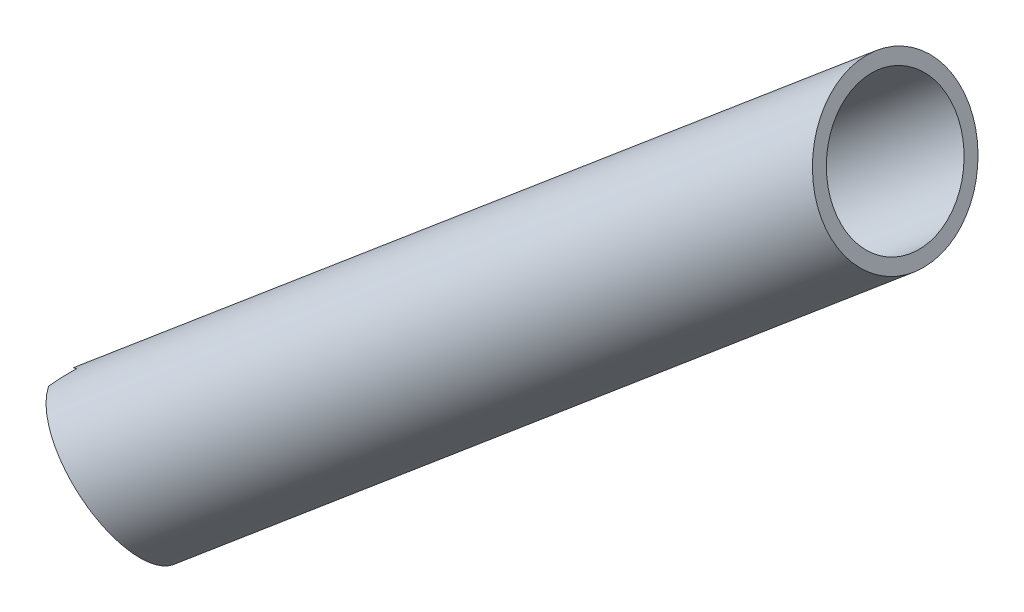
ISO-10303-21;
HEADER;
FILE_DESCRIPTION(('STEP AP214'),'2;1');
FILE_NAME('part.step','',(''),(''),'','','');
FILE_SCHEMA(('AUTOMOTIVE_DESIGN { 1 0 10303 214 1 1 1 1 }'));
ENDSEC;
DATA;
#1=APPLICATION_CONTEXT('core data for automotive mechanical design processes');
#2=APPLICATION_PROTOCOL_DEFINITION('international standard','automotive_design',2000,#1);
#3=PRODUCT_CONTEXT('',#1,'mechanical');
#4=PRODUCT('Part','Part','',(#3));
#5=PRODUCT_RELATED_PRODUCT_CATEGORY('part','',(#4));
#6=PRODUCT_DEFINITION_FORMATION('','',#4);
#7=PRODUCT_DEFINITION_CONTEXT('part definition',#1,'design');
#8=PRODUCT_DEFINITION('design','',#6,#7);
#9=PRODUCT_DEFINITION_SHAPE('','',#8);
#10=(LENGTH_UNIT() NAMED_UNIT(*) SI_UNIT(.MILLI.,.METRE.));
#11=(NAMED_UNIT(*) PLANE_ANGLE_UNIT() SI_UNIT($,.RADIAN.));
#12=(NAMED_UNIT(*) SI_UNIT($,.STERADIAN.) SOLID_ANGLE_UNIT());
#13=UNCERTAINTY_MEASURE_WITH_UNIT(LENGTH_MEASURE(1.E-05),#10,'distance_accuracy_value','');
#14=(GEOMETRIC_REPRESENTATION_CONTEXT(3) GLOBAL_UNCERTAINTY_ASSIGNED_CONTEXT((#13)) GLOBAL_UNIT_ASSIGNED_CONTEXT((#10,
#11,#12)) REPRESENTATION_CONTEXT('',''));
#15=CARTESIAN_POINT('',(0.,0.,0.));
#16=DIRECTION('',(0.,0.,1.));
#17=DIRECTION('',(1.,0.,0.));
#18=AXIS2_PLACEMENT_3D('',#15,#16,#17);
#19=CARTESIAN_POINT('',(-160.,500.,-1140.));
#20=DIRECTION('',(0.764911198117051,0.64413574578278,0.));
#21=DIRECTION('',(-0.64413574578278,0.764911198117051,0.));
#22=AXIS2_PLACEMENT_3D('',#19,#20,#21);
#23=CYLINDRICAL_SURFACE('',#22,7.90000000000002);
#24=CARTESIAN_POINT('',(-64.9999999999999,580.,-1140.));
#25=DIRECTION('',(0.939391078868926,0.342847489332319,0.));
#26=DIRECTION('',(-0.342847489332319,0.939391078868926,0.));
#27=AXIS2_PLACEMENT_3D('',#24,#25,#26);
#28=ELLIPSE('',#27,8.40970302753142,7.90000000000002);
#29=CARTESIAN_POINT('',(-67.8832455690195,587.9,-1140.));
#30=VERTEX_POINT('',#29);
#31=EDGE_CURVE('E91',#30,#30,#28,.T.);
#32=ORIENTED_EDGE('',*,*,#31,.T.);
#33=EDGE_LOOP('',(#32));
#34=FACE_BOUND('',#33,.T.);
#35=CARTESIAN_POINT('',(-149.806560441629,504.219410276848,-1147.15992461063));
#36=CARTESIAN_POINT('',(-149.803412714936,504.062578865998,-1147.10303301487));
#37=CARTESIAN_POINT('',(-149.803002824694,503.90666757739,-1147.04351815598));
#38=CARTESIAN_POINT('',(-149.807174148805,503.596954687256,-1146.91949265139));
#39=CARTESIAN_POINT('',(-149.811754107092,503.443152564667,-1146.85498326673));
#40=CARTESIAN_POINT('',(-149.825416717647,503.137909616455,-1146.72121745741));
#41=CARTESIAN_POINT('',(-149.834497559939,502.986467866867,-1146.65196295059));
#42=CARTESIAN_POINT('',(-149.856708176099,502.686082127626,-1146.50883251815));
#43=CARTESIAN_POINT('',(-149.869838294467,502.537138351631,-1146.43495619976));
#44=CARTESIAN_POINT('',(-149.914918191717,502.091648632249,-1146.20515941715));
#45=CARTESIAN_POINT('',(-149.952418847364,501.799207149699,-1146.04228196853));
#46=CARTESIAN_POINT('',(-150.038602793966,501.227098720645,-1145.69816413877));
#47=CARTESIAN_POINT('',(-150.08728545058,500.947431050579,-1145.51692479959));
#48=CARTESIAN_POINT('',(-150.176166467694,500.485993797294,-1145.19295142569));
#49=CARTESIAN_POINT('',(-150.21444651852,500.30030376809,-1145.05525603021));
#50=CARTESIAN_POINT('',(-150.293177031898,499.93748765105,-1144.76960566888));
#51=CARTESIAN_POINT('',(-150.333627037572,499.76035977529,-1144.62165286079));
#52=CARTESIAN_POINT('',(-150.41493741318,499.416706923316,-1144.31472636185));
#53=CARTESIAN_POINT('',(-150.455796668533,499.250159211458,-1144.15577795003));
#54=CARTESIAN_POINT('',(-150.535984940902,498.929712093816,-1143.82523144126));
#55=CARTESIAN_POINT('',(-150.575314676885,498.77580670659,-1143.65363940014));
#56=CARTESIAN_POINT('',(-150.636413726883,498.537191613577,-1143.36134630922));
#57=CARTESIAN_POINT('',(-150.659369208026,498.447666380083,-1143.24482136708));
#58=CARTESIAN_POINT('',(-150.702959480765,498.276328771042,-1143.00574885048));
#59=CARTESIAN_POINT('',(-150.723593932405,498.194517525633,-1142.88320039753));
#60=CARTESIAN_POINT('',(-150.761765660328,498.040177323664,-1142.63227022741));
#61=CARTESIAN_POINT('',(-150.779309622592,497.967628424939,-1142.50390187736));
#62=CARTESIAN_POINT('',(-150.810679451942,497.833135087987,-1142.24134240492));
#63=CARTESIAN_POINT('',(-150.824507390517,497.771184748647,-1142.10715457525));
#64=CARTESIAN_POINT('',(-150.848118453876,497.658561828138,-1141.83171119361));
#65=CARTESIAN_POINT('',(-150.857847067333,497.608045133176,-1141.69038677191));
#66=CARTESIAN_POINT('',(-150.872810744769,497.520524705178,-1141.40337838084));
#67=CARTESIAN_POINT('',(-150.878046135992,497.483519988169,-1141.25769472976));
#68=CARTESIAN_POINT('',(-150.88425953251,497.423636083401,-1140.96326577428));
#69=CARTESIAN_POINT('',(-150.885234688495,497.400766358113,-1140.81451848767));
#70=CARTESIAN_POINT('',(-150.883564796822,497.369151410044,-1140.51555526804));
#71=CARTESIAN_POINT('',(-150.880919245899,497.36040815116,-1140.36533913375));
#72=CARTESIAN_POINT('',(-150.872649191556,497.356270720296,-1140.05354873727));
#73=CARTESIAN_POINT('',(-150.866816112412,497.361927112301,-1139.89196773495));
#74=CARTESIAN_POINT('',(-150.853396773858,497.387562793961,-1139.57004836283));
#75=CARTESIAN_POINT('',(-150.845810288049,497.407543933926,-1139.40971015626));
#76=CARTESIAN_POINT('',(-150.830208257881,497.46041152046,-1139.09085085618));
#77=CARTESIAN_POINT('',(-150.822191766517,497.493327553366,-1138.93233479217));
#78=CARTESIAN_POINT('',(-150.806974264905,497.570617514907,-1138.61806555402));
#79=CARTESIAN_POINT('',(-150.799773520066,497.614995157372,-1138.46231329293));
#80=CARTESIAN_POINT('',(-150.784686123366,497.734396392272,-1138.09006933463));
#81=CARTESIAN_POINT('',(-150.777752286438,497.814498241743,-1137.87516047941));
#82=CARTESIAN_POINT('',(-150.770240550815,497.991900702721,-1137.45243163086));
#83=CARTESIAN_POINT('',(-150.769664980824,498.089207602289,-1137.24461426255));
#84=CARTESIAN_POINT('',(-150.776899144461,498.298602569902,-1136.83664419825));
#85=CARTESIAN_POINT('',(-150.784711525586,498.410695295011,-1136.63649394288));
#86=CARTESIAN_POINT('',(-150.810374372665,498.647652491678,-1136.24461176559));
#87=CARTESIAN_POINT('',(-150.82822365703,498.772515458452,-1136.0528788556));
#88=CARTESIAN_POINT('',(-150.87576016982,499.035827340166,-1135.67506417485));
#89=CARTESIAN_POINT('',(-150.905664024883,499.17448784334,-1135.4891568517));
#90=CARTESIAN_POINT('',(-150.978476837941,499.461793579474,-1135.12787604439));
#91=CARTESIAN_POINT('',(-151.021386234156,499.610439148748,-1134.95250291541));
#92=CARTESIAN_POINT('',(-151.121114849397,499.916128849568,-1134.61357003432));
#93=CARTESIAN_POINT('',(-151.177926638144,500.073168459905,-1134.45000403204));
#94=CARTESIAN_POINT('',(-151.30614543557,500.394197000996,-1134.13591398983));
#95=CARTESIAN_POINT('',(-151.37755181909,500.558185633849,-1133.98538939166));
#96=CARTESIAN_POINT('',(-151.534205078807,500.889109482846,-1133.70087393506));
#97=CARTESIAN_POINT('',(-151.61923641537,501.055967572702,-1133.56667510811));
#98=CARTESIAN_POINT('',(-151.803916700404,501.393277679504,-1133.31369935362));
#99=CARTESIAN_POINT('',(-151.903565733941,501.56372971736,-1133.19492251584));
#100=CARTESIAN_POINT('',(-152.117134039143,501.90641019463,-1132.97418897949));
#101=CARTESIAN_POINT('',(-152.231044844533,502.078637524963,-1132.87222238432));
#102=CARTESIAN_POINT('',(-152.47253128618,502.423185824435,-1132.68621994822));
#103=CARTESIAN_POINT('',(-152.600105247515,502.595506779526,-1132.60218191327));
#104=CARTESIAN_POINT('',(-152.852438015651,502.918666847344,-1132.46160205185));
#105=CARTESIAN_POINT('',(-152.975822771943,503.069690141363,-1132.40300631195));
#106=CARTESIAN_POINT('',(-153.231572711032,503.369243187396,-1132.30106129215));
#107=CARTESIAN_POINT('',(-153.363937091801,503.51777316063,-1132.25771065275));
#108=CARTESIAN_POINT('',(-153.636549116523,503.811228086861,-1132.1865377888));
#109=CARTESIAN_POINT('',(-153.776795682313,503.956153529009,-1132.15871344616));
#110=CARTESIAN_POINT('',(-154.063980911658,504.241452816752,-1132.11866150717));
#111=CARTESIAN_POINT('',(-154.210919641058,504.381826617538,-1132.10643406431));
#112=CARTESIAN_POINT('',(-154.505395775171,504.652791867873,-1132.09761063784));
#113=CARTESIAN_POINT('',(-154.652763499588,504.783552614467,-1132.10052688318));
#114=CARTESIAN_POINT('',(-154.951400323584,505.039511037646,-1132.12063320138));
#115=CARTESIAN_POINT('',(-155.102670989728,505.164706423728,-1132.13782909497));
#116=CARTESIAN_POINT('',(-155.407774476389,505.409006910912,-1132.18614358317));
#117=CARTESIAN_POINT('',(-155.561606312485,505.528114283509,-1132.21725694216));
#118=CARTESIAN_POINT('',(-155.870688099299,505.760038093503,-1132.29298488145));
#119=CARTESIAN_POINT('',(-156.025938180021,505.872853947312,-1132.33760071176));
#120=CARTESIAN_POINT('',(-156.348336761622,506.100324413173,-1132.44372141861));
#121=CARTESIAN_POINT('',(-156.515502563587,506.214479963008,-1132.5062436154));
#122=CARTESIAN_POINT('',(-156.848617796161,506.435453751191,-1132.64579438458));
#123=CARTESIAN_POINT('',(-157.014567163035,506.5422716075,-1132.72282371151));
#124=CARTESIAN_POINT('',(-157.344059436215,506.749009632226,-1132.8910021276));
#125=CARTESIAN_POINT('',(-157.507597581252,506.848917301009,-1132.98217588381));
#126=CARTESIAN_POINT('',(-157.830424790232,507.042084518197,-1133.17808195069));
#127=CARTESIAN_POINT('',(-157.989713646653,507.135343742283,-1133.2828149221));
#128=CARTESIAN_POINT('',(-158.321023816635,507.326635403325,-1133.5187594204));
#129=CARTESIAN_POINT('',(-158.492298111107,507.423910717636,-1133.6516391644));
#130=CARTESIAN_POINT('',(-158.824777960127,507.612216058991,-1133.93361793726));
#131=CARTESIAN_POINT('',(-158.985979922449,507.703243859032,-1134.08272270127));
#132=CARTESIAN_POINT('',(-159.29459497586,507.880454319911,-1134.3965292088));
#133=CARTESIAN_POINT('',(-159.442036425264,507.966646792428,-1134.5611974018));
#134=CARTESIAN_POINT('',(-159.719219140476,508.136369595868,-1134.90601444266));
#135=CARTESIAN_POINT('',(-159.848975427366,508.219902139224,-1135.08614993852));
#136=CARTESIAN_POINT('',(-160.036820524556,508.35233561473,-1135.38387079168));
#137=CARTESIAN_POINT('',(-160.102428875081,508.401342990473,-1135.49669350841));
#138=CARTESIAN_POINT('',(-160.224444722418,508.499738694588,-1135.72702972993));
#139=CARTESIAN_POINT('',(-160.280855628665,508.549126874656,-1135.84454147633));
#140=CARTESIAN_POINT('',(-160.383119568484,508.64861588305,-1136.08344343307));
#141=CARTESIAN_POINT('',(-160.428996330599,508.698714834365,-1136.20482421115));
#142=CARTESIAN_POINT('',(-160.509207650779,508.800059001062,-1136.4508990741));
#143=CARTESIAN_POINT('',(-160.543542374601,508.851304199972,-1136.57559311138));
#144=CARTESIAN_POINT('',(-160.600009720585,508.955466543982,-1136.82813697473));
#145=CARTESIAN_POINT('',(-160.622053062138,509.008393044428,-1136.95600302028));
#146=CARTESIAN_POINT('',(-160.653152637991,509.115506379648,-1137.21277637102));
#147=CARTESIAN_POINT('',(-160.662209326279,509.169693170298,-1137.34168363966));
#148=CARTESIAN_POINT('',(-160.667507249095,509.279117727255,-1137.59942425933));
#149=CARTESIAN_POINT('',(-160.663738192544,509.334356302138,-1137.72825746801));
#150=CARTESIAN_POINT('',(-160.644058457835,509.445455763379,-1137.98473675664));
#151=CARTESIAN_POINT('',(-160.628143961979,509.501316839968,-1138.11238245055));
#152=CARTESIAN_POINT('',(-160.579273569674,509.628694210207,-1138.40081781416));
#153=CARTESIAN_POINT('',(-160.542817774103,509.700259840295,-1138.56099179616));
#154=CARTESIAN_POINT('',(-160.454380817984,509.842682546691,-1138.87729394643));
#155=CARTESIAN_POINT('',(-160.402393666705,509.913539338669,-1139.03342052825));
#156=CARTESIAN_POINT('',(-160.285209372328,510.05392885547,-1139.34192714265));
#157=CARTESIAN_POINT('',(-160.219966947927,510.123456122905,-1139.49429226902));
#158=CARTESIAN_POINT('',(-160.078541530497,510.260249072309,-1139.79492868523));
#159=CARTESIAN_POINT('',(-160.002354191034,510.327513842639,-1139.94319832065));
#160=CARTESIAN_POINT('',(-159.775000696904,510.512875723399,-1140.35539050326));
#161=CARTESIAN_POINT('',(-159.613356336221,510.627693579554,-1140.61502433626));
#162=CARTESIAN_POINT('',(-159.267635192649,510.845067830347,-1141.12439165715));
#163=CARTESIAN_POINT('',(-159.083538824169,510.947613362733,-1141.37411624559));
#164=CARTESIAN_POINT('',(-158.697870959506,511.137854427647,-1141.86531730236));
#165=CARTESIAN_POINT('',(-158.496309897056,511.225558735364,-1142.10679857682));
#166=CARTESIAN_POINT('',(-158.078930704352,511.38364568112,-1142.58271538395));
#167=CARTESIAN_POINT('',(-157.863121034809,511.454038483323,-1142.8171549797));
#168=CARTESIAN_POINT('',(-157.404142542677,511.578961589042,-1143.29552569565));
#169=CARTESIAN_POINT('',(-157.160111965931,511.632078347487,-1143.53900989313));
#170=CARTESIAN_POINT('',(-156.785771746121,511.691585564212,-1143.89814156416));
#171=CARTESIAN_POINT('',(-156.659780100607,511.708051535478,-1144.01668470441));
#172=CARTESIAN_POINT('',(-156.405136774205,511.733739688546,-1144.25176963034));
#173=CARTESIAN_POINT('',(-156.276484138098,511.742959221086,-1144.36831066884));
#174=CARTESIAN_POINT('',(-156.146646488623,511.748262457653,-1144.48376510167));
#175=B_SPLINE_CURVE_WITH_KNOTS('',3,(#35,#36,#37,#38,#39,#40,#41,#42,#43,#44,#45,#46,#47,#48,
#49,#50,#51,#52,#53,#54,#55,#56,#57,#58,#59,#60,#61,#62,#63,#64,#65,#66,#67,#68,#69,#70,#71,#72,
#73,#74,#75,#76,#77,#78,#79,#80,#81,#82,#83,#84,#85,#86,#87,#88,#89,#90,#91,#92,#93,#94,#95,#96,
#97,#98,#99,#100,#101,#102,#103,#104,#105,#106,#107,#108,#109,#110,#111,#112,#113,#114,#115,
#116,#117,#118,#119,#120,#121,#122,#123,#124,#125,#126,#127,#128,#129,#130,#131,#132,#133,#134,
#135,#136,#137,#138,#139,#140,#141,#142,#143,#144,#145,#146,#147,#148,#149,#150,#151,#152,#153,
#154,#155,#156,#157,#158,#159,#160,#161,#162,#163,#164,#165,#166,#167,#168,#169,#170,#171,#172,
#173,#174),.UNSPECIFIED.,.F.,.F.,(4,2,2,2,2,2,2,2,2,2,2,2,2,2,2,2,2,2,2,2,2,2,2,2,2,2,2,2,2,2,2,
2,2,2,2,2,2,2,2,2,2,2,2,2,2,2,2,2,2,2,2,2,2,2,2,2,2,2,2,2,2,2,2,2,2,2,2,2,2,4),(0.,
0.500505294840843,1.00088462944797,1.50106290576027,2.00128374753636,3.01075979916434,
4.02017859884909,4.72280679463363,5.42528763011329,6.12620393643749,6.82678668611954,
7.27268730327411,7.71865314598701,8.16364200733878,8.60838229370893,9.05886297539966,
9.50931084557401,9.96005993609781,10.4108716854913,10.8955005162781,11.3801919572764,
11.8659985605441,12.3519627744806,13.0393556253134,13.7270002241237,14.4148619286174,
15.1026426719926,15.8033772189901,16.5041353797735,17.204519827942,17.9048742814252,
18.5950806691492,19.2852910736478,19.9750936712964,20.6648118048518,21.2749365567802,
21.88500688617,22.4949939694129,23.1049870557563,23.6954568616028,24.2861674753503,
24.8766560559193,25.4671993181077,26.102126391741,26.7370864981155,27.37316665047,
28.0092778104098,28.7212499471898,29.4334745711558,30.1441974071273,30.8543127702108,
31.2722216790019,31.6899753176869,32.1067785123739,32.5235757210057,32.9433622333332,
33.363134070357,33.7832428019095,34.2034836414337,34.7401585074686,35.2770406467258,
35.8157886335588,36.3547511619548,37.3332307477929,38.3125700808003,39.2913283199448,
40.2695105180302,41.3145701855105,41.8357334188842,42.3570870984278),.UNSPECIFIED.);
#176=CARTESIAN_POINT('',(-150.876299579214,497.493603865835,-1141.28935680118));
#177=VERTEX_POINT('',#176);
#178=CARTESIAN_POINT('',(-160.093324456324,510.244671755702,-1139.76079676309));
#179=VERTEX_POINT('',#178);
#180=EDGE_CURVE('E83',#177,#179,#175,.T.);
#181=ORIENTED_EDGE('',*,*,#180,.T.);
#182=CARTESIAN_POINT('',(-157.622451985765,511.518945571947,-1136.93099677116));
#183=CARTESIAN_POINT('',(-157.74142176793,511.475689595474,-1137.03431424286));
#184=CARTESIAN_POINT('',(-157.858871176709,511.431000410542,-1137.13879485353));
#185=CARTESIAN_POINT('',(-158.090393931416,511.338975449613,-1137.35035560297));
#186=CARTESIAN_POINT('',(-158.204466493866,511.291639066675,-1137.45743633467));
#187=CARTESIAN_POINT('',(-158.429589151568,511.194237755922,-1137.67514274756));
#188=CARTESIAN_POINT('',(-158.540614185111,511.144156814688,-1137.78578722879));
#189=CARTESIAN_POINT('',(-158.758350850049,511.041799714003,-1138.01025170141));
#190=CARTESIAN_POINT('',(-158.865062752784,510.989523693068,-1138.12407149227));
#191=CARTESIAN_POINT('',(-159.077367136738,510.881085723736,-1138.35947554379));
#192=CARTESIAN_POINT('',(-159.182777205846,510.824851588775,-1138.48119160817));
#193=CARTESIAN_POINT('',(-159.387430866337,510.710605613162,-1138.72889386367));
#194=CARTESIAN_POINT('',(-159.486675119624,510.652593964331,-1138.85487959419));
#195=CARTESIAN_POINT('',(-159.677649770038,510.535281076646,-1139.11130759006));
#196=CARTESIAN_POINT('',(-159.769398637489,510.475983493365,-1139.24173770454));
#197=CARTESIAN_POINT('',(-159.944230933701,510.356370029556,-1139.50779465354));
#198=CARTESIAN_POINT('',(-160.02731772211,510.296054554449,-1139.64341944516));
#199=CARTESIAN_POINT('',(-160.173952769336,510.181981111548,-1139.90396878536));
#200=CARTESIAN_POINT('',(-160.238649685351,510.128287554244,-1140.02827206605));
#201=CARTESIAN_POINT('',(-160.358602270144,510.020789290627,-1140.28135693587));
#202=CARTESIAN_POINT('',(-160.413857306157,509.966984577108,-1140.41013882444));
#203=CARTESIAN_POINT('',(-160.512988176134,509.860103509674,-1140.67087400609));
#204=CARTESIAN_POINT('',(-160.55695852991,509.807024885629,-1140.80279011461));
#205=CARTESIAN_POINT('',(-160.632709021363,509.701472342839,-1141.07033626289));
#206=CARTESIAN_POINT('',(-160.664489929418,509.648998386083,-1141.20596606735));
#207=CARTESIAN_POINT('',(-160.715006872732,509.544245724544,-1141.48180556634));
#208=CARTESIAN_POINT('',(-160.733568707833,509.491978341487,-1141.62205182033));
#209=CARTESIAN_POINT('',(-160.756248171341,509.388463682111,-1141.90408175563));
#210=CARTESIAN_POINT('',(-160.760366340042,509.337216367707,-1142.04586537924));
#211=CARTESIAN_POINT('',(-160.754097543693,509.235536205461,-1142.3297561735));
#212=CARTESIAN_POINT('',(-160.743677854631,509.185105454404,-1142.47186335292));
#213=CARTESIAN_POINT('',(-160.708881927405,509.08485828678,-1142.75457251697));
#214=CARTESIAN_POINT('',(-160.684503608308,509.035041962943,-1142.89517427399));
#215=CARTESIAN_POINT('',(-160.619234622774,508.92964609671,-1143.1900240694));
#216=CARTESIAN_POINT('',(-160.576731820667,508.874081881722,-1143.34391894504));
#217=CARTESIAN_POINT('',(-160.477535042902,508.762273155677,-1143.64678237977));
#218=CARTESIAN_POINT('',(-160.420838813235,508.706028537918,-1143.79575015214));
#219=CARTESIAN_POINT('',(-160.295107468435,508.591888643663,-1144.08805771907));
#220=CARTESIAN_POINT('',(-160.226049882857,508.533990525275,-1144.23138667474));
#221=CARTESIAN_POINT('',(-160.077480044681,508.415814802243,-1144.51151527538));
#222=CARTESIAN_POINT('',(-159.997964704902,508.355536498647,-1144.64831297595));
#223=CARTESIAN_POINT('',(-159.803011338234,508.211925694022,-1144.95793333523));
#224=CARTESIAN_POINT('',(-159.684260786551,508.127430057005,-1145.12813790705));
#225=CARTESIAN_POINT('',(-159.434456497365,507.951653657554,-1145.45553467209));
#226=CARTESIAN_POINT('',(-159.303399455782,507.860371074318,-1145.61272334932));
#227=CARTESIAN_POINT('',(-159.03159432309,507.670022091053,-1145.913390899));
#228=CARTESIAN_POINT('',(-158.890846624529,507.570956006293,-1146.05687032622));
#229=CARTESIAN_POINT('',(-158.601865825113,507.364332007244,-1146.32944714501));
#230=CARTESIAN_POINT('',(-158.453632810799,507.256774191123,-1146.45854470282));
#231=CARTESIAN_POINT('',(-158.150200544893,507.031677523824,-1146.70279490537));
#232=CARTESIAN_POINT('',(-157.994948735774,506.914054025427,-1146.8178043829));
#233=CARTESIAN_POINT('',(-157.680642095815,506.669542662237,-1147.03167031549));
#234=CARTESIAN_POINT('',(-157.521587188514,506.542654611074,-1147.13052644549));
#235=CARTESIAN_POINT('',(-157.201486540596,506.27975707811,-1147.31126592857));
#236=CARTESIAN_POINT('',(-157.040441549515,506.143750949931,-1147.39315547712));
#237=CARTESIAN_POINT('',(-156.718002966874,505.862930693156,-1147.53925426586));
#238=CARTESIAN_POINT('',(-156.55660938518,505.718116810763,-1147.60346399997));
#239=CARTESIAN_POINT('',(-156.237103955664,505.422118748619,-1147.71285951359));
#240=CARTESIAN_POINT('',(-156.078976156347,505.271034783254,-1147.75826948711));
#241=CARTESIAN_POINT('',(-155.765541227942,504.961684737961,-1147.83067280585));
#242=CARTESIAN_POINT('',(-155.610234097897,504.80341866047,-1147.85766615732));
#243=CARTESIAN_POINT('',(-155.303959830791,504.48078240255,-1147.89288167342));
#244=CARTESIAN_POINT('',(-155.152991705911,504.316413631306,-1147.90110814449));
#245=CARTESIAN_POINT('',(-154.856743035246,503.982771146797,-1147.8986526169));
#246=CARTESIAN_POINT('',(-154.711462190105,503.813497692513,-1147.88797161484));
#247=CARTESIAN_POINT('',(-154.436906261793,503.482381940119,-1147.84906403374));
#248=CARTESIAN_POINT('',(-154.307201836767,503.32075715321,-1147.8220038036));
#249=CARTESIAN_POINT('',(-154.054735604842,502.995648972123,-1147.75162013529));
#250=CARTESIAN_POINT('',(-153.931973460054,502.832165668867,-1147.70829748943));
#251=CARTESIAN_POINT('',(-153.694120742834,502.504635328935,-1147.60578598669));
#252=CARTESIAN_POINT('',(-153.57902920696,502.340588365788,-1147.54659912711));
#253=CARTESIAN_POINT('',(-153.357038485553,502.013210225149,-1147.41288164802));
#254=CARTESIAN_POINT('',(-153.250139446674,501.849879060521,-1147.33835075391));
#255=CARTESIAN_POINT('',(-153.044876654295,501.525222665821,-1147.17456674038));
#256=CARTESIAN_POINT('',(-152.946514019874,501.36389770112,-1147.08531169512));
#257=CARTESIAN_POINT('',(-152.758502173211,501.044577009894,-1146.89279031913));
#258=CARTESIAN_POINT('',(-152.668852938987,500.886581274972,-1146.78952402375));
#259=CARTESIAN_POINT('',(-152.498197953132,500.575140649365,-1146.56967050818));
#260=CARTESIAN_POINT('',(-152.417196116179,500.421697842298,-1146.45307730395));
#261=CARTESIAN_POINT('',(-152.263652574012,500.1207310301,-1146.20734943975));
#262=CARTESIAN_POINT('',(-152.191111399691,499.973207396769,-1146.07821399372));
#263=CARTESIAN_POINT('',(-152.049676335888,499.676191976131,-1145.79947079795));
#264=CARTESIAN_POINT('',(-151.981314111274,499.527179935947,-1145.64908142225));
#265=CARTESIAN_POINT('',(-151.852916320782,499.239067559404,-1145.33573754203));
#266=CARTESIAN_POINT('',(-151.792881881131,499.099968564891,-1145.17278134263));
#267=CARTESIAN_POINT('',(-151.680067847139,498.833588476338,-1144.83508371737));
#268=CARTESIAN_POINT('',(-151.627289080315,498.706308730832,-1144.6603409506));
#269=CARTESIAN_POINT('',(-151.527581122807,498.465812234862,-1144.29987797107));
#270=CARTESIAN_POINT('',(-151.48065031242,498.35259159049,-1144.11416081897));
#271=CARTESIAN_POINT('',(-151.401866453511,498.168723318964,-1143.77967080036));
#272=CARTESIAN_POINT('',(-151.369149081919,498.094462173648,-1143.633080662));
#273=CARTESIAN_POINT('',(-151.305011414343,497.956764611867,-1143.33463554471));
#274=CARTESIAN_POINT('',(-151.273590819706,497.893325692345,-1143.18278179301));
#275=CARTESIAN_POINT('',(-151.210986577634,497.778870529287,-1142.87471288827));
#276=CARTESIAN_POINT('',(-151.179802603724,497.727831955281,-1142.71850614833));
#277=CARTESIAN_POINT('',(-151.116390197549,497.639657888062,-1142.40241023997));
#278=CARTESIAN_POINT('',(-151.084162014056,497.602519109455,-1142.24252195125));
#279=CARTESIAN_POINT('',(-151.023560421079,497.549121611248,-1141.95006277384));
#280=CARTESIAN_POINT('',(-150.995570237228,497.530277083819,-1141.81788412264));
#281=CARTESIAN_POINT('',(-150.937445958239,497.503577886743,-1141.55289990652));
#282=CARTESIAN_POINT('',(-150.907312377357,497.495720590267,-1141.42009449907));
#283=CARTESIAN_POINT('',(-150.844443956763,497.491428841131,-1141.15506526896));
#284=CARTESIAN_POINT('',(-150.811712118857,497.49498138856,-1141.02284095616));
#285=CARTESIAN_POINT('',(-150.743328466536,497.513538864201,-1140.75995765746));
#286=CARTESIAN_POINT('',(-150.707676609137,497.528543961026,-1140.62929869461));
#287=CARTESIAN_POINT('',(-150.633459646215,497.56961527473,-1140.3708380292));
#288=CARTESIAN_POINT('',(-150.594899903146,497.595661521665,-1140.24303160447));
#289=CARTESIAN_POINT('',(-150.514987089377,497.658073576131,-1139.99089528725));
#290=CARTESIAN_POINT('',(-150.47363396037,497.694439599123,-1139.86656546741));
#291=CARTESIAN_POINT('',(-150.345700712335,497.817728319617,-1139.49929648248));
#292=CARTESIAN_POINT('',(-150.255322757674,497.918796637935,-1139.26234151592));
#293=CARTESIAN_POINT('',(-150.082346239169,498.13232022973,-1138.84075418085));
#294=CARTESIAN_POINT('',(-150.00063560509,498.240747513186,-1138.65362579457));
#295=CARTESIAN_POINT('',(-149.834633601934,498.473999508921,-1138.29093230282));
#296=CARTESIAN_POINT('',(-149.750340140261,498.598837801989,-1138.11537695717));
#297=CARTESIAN_POINT('',(-149.580712315746,498.861899764899,-1137.77403183389));
#298=CARTESIAN_POINT('',(-149.495375218306,499.000172383951,-1137.6082816));
#299=CARTESIAN_POINT('',(-149.325453938358,499.287190050531,-1137.28589596187));
#300=CARTESIAN_POINT('',(-149.240869504394,499.435931440343,-1137.12925740868));
#301=CARTESIAN_POINT('',(-149.055403906338,499.775535398866,-1136.79056577818));
#302=CARTESIAN_POINT('',(-148.954979371227,499.968523152004,-1136.610394598));
#303=CARTESIAN_POINT('',(-148.808251744431,500.265297037605,-1136.34837997247));
#304=CARTESIAN_POINT('',(-148.760205170052,500.364964514517,-1136.26278865003));
#305=CARTESIAN_POINT('',(-148.665431715985,500.566825490672,-1136.09388761532));
#306=CARTESIAN_POINT('',(-148.61870481266,500.669018944607,-1136.01057786216));
#307=CARTESIAN_POINT('',(-148.572729413358,500.772400017214,-1135.92832864524));
#308=B_SPLINE_CURVE_WITH_KNOTS('',3,(#182,#183,#184,#185,#186,#187,#188,#189,#190,#191,#192,
#193,#194,#195,#196,#197,#198,#199,#200,#201,#202,#203,#204,#205,#206,#207,#208,#209,#210,#211,
#212,#213,#214,#215,#216,#217,#218,#219,#220,#221,#222,#223,#224,#225,#226,#227,#228,#229,#230,
#231,#232,#233,#234,#235,#236,#237,#238,#239,#240,#241,#242,#243,#244,#245,#246,#247,#248,#249,
#250,#251,#252,#253,#254,#255,#256,#257,#258,#259,#260,#261,#262,#263,#264,#265,#266,#267,#268,
#269,#270,#271,#272,#273,#274,#275,#276,#277,#278,#279,#280,#281,#282,#283,#284,#285,#286,#287,
#288,#289,#290,#291,#292,#293,#294,#295,#296,#297,#298,#299,#300,#301,#302,#303,#304,#305,#306,
#307),.UNSPECIFIED.,.F.,.F.,(4,2,2,2,2,2,2,2,2,2,2,2,2,2,2,2,2,2,2,2,2,2,2,2,2,2,2,2,2,2,2,2,2,
2,2,2,2,2,2,2,2,2,2,2,2,2,2,2,2,2,2,2,2,2,2,2,2,2,2,2,2,2,4),(0.,0.490192627478768,
0.980498109356843,1.47405523295509,1.96758125826359,2.47908695979019,2.99053765566753,
3.50068741242949,4.01063856209215,4.46052435348931,4.910440283094,5.35645476850955,
5.80244106091064,6.2542009242262,6.70594388837801,7.15870534609894,7.61153431845944,
8.11792861201149,8.62440337535419,9.13180833396205,9.63936341861858,10.3106858674705,
10.9821890730105,11.6536650933779,12.3251333523172,13.0029412100443,13.6807627065988,
14.3583362543936,15.0358908707135,15.7051149190552,16.3743387401071,17.0434089787509,
17.7124439527394,18.3386719167804,18.9648693753117,19.5909880334781,20.2171178972056,
20.8433297198066,21.4695399626131,22.0960324994665,22.7225643265453,23.3892479392868,
24.0560216247272,24.7228712934472,25.3895358528627,25.8918077725373,26.3939633644701,
26.8952078613123,27.3963338077008,27.8051658347764,28.2139001015611,28.6221688384727,
29.0304435863769,29.4379830242856,29.8455309716492,30.6614517210277,31.354088614068,
32.047302344062,32.7431440128298,33.4387437548775,34.2856294974275,34.7052486866609,
35.1248603549259),.UNSPECIFIED.);
#309=EDGE_CURVE('E81',#179,#177,#308,.T.);
#310=ORIENTED_EDGE('',*,*,#309,.T.);
#311=EDGE_LOOP('',(#181,#310));
#312=FACE_BOUND('',#311,.T.);
#313=ADVANCED_FACE('F41',(#34,#312),#23,.F.);
#314=CARTESIAN_POINT('',(-65.,580.,-1140.));
#315=DIRECTION('',(0.939391078868926,0.342847489332319,0.));
#316=DIRECTION('',(-0.342847489332319,0.939391078868926,0.));
#317=AXIS2_PLACEMENT_3D('',#314,#315,#316);
#318=PLANE('',#317);
#319=ORIENTED_EDGE('',*,*,#31,.F.);
#320=EDGE_LOOP('',(#319));
#321=FACE_BOUND('',#320,.T.);
#322=CARTESIAN_POINT('',(-64.9999999999999,580.,-1140.));
#323=DIRECTION('',(0.939391078868926,0.342847489332319,0.));
#324=DIRECTION('',(-0.342847489332319,0.939391078868926,0.));
#325=AXIS2_PLACEMENT_3D('',#322,#323,#324);
#326=ELLIPSE('',#325,10.1129340204491,9.49999999999999);
#327=CARTESIAN_POINT('',(-68.4671940386943,589.5,-1140.));
#328=VERTEX_POINT('',#327);
#329=EDGE_CURVE('E90',#328,#328,#326,.T.);
#330=ORIENTED_EDGE('',*,*,#329,.T.);
#331=EDGE_LOOP('',(#330));
#332=FACE_BOUND('',#331,.T.);
#333=ADVANCED_FACE('F43',(#321,#332),#318,.T.);
#334=CARTESIAN_POINT('',(-160.,500.,-1140.));
#335=DIRECTION('',(0.764911198117051,0.64413574578278,0.));
#336=DIRECTION('',(-0.64413574578278,0.764911198117051,0.));
#337=AXIS2_PLACEMENT_3D('',#334,#335,#336);
#338=CYLINDRICAL_SURFACE('',#337,9.49999999999999);
#339=ORIENTED_EDGE('',*,*,#329,.F.);
#340=EDGE_LOOP('',(#339));
#341=FACE_BOUND('',#340,.T.);
#342=CARTESIAN_POINT('',(-160.,500.,-1140.));
#343=DIRECTION('',(0.582837597226065,0.211973530034795,0.784453668373305));
#344=DIRECTION('',(0.523402542330844,0.640510105074051,-0.561957813345127));
#345=AXIS2_PLACEMENT_3D('',#342,#343,#344);
#346=ELLIPSE('',#345,16.3129690811985,9.49999999999999);
#347=CARTESIAN_POINT('',(-165.904921488319,507.012094267378,-1137.50752408192));
#348=VERTEX_POINT('',#347);
#349=CARTESIAN_POINT('',(-164.237924140915,508.810312222059,-1139.23198964402));
#350=VERTEX_POINT('',#349);
#351=EDGE_CURVE('E11',#348,#350,#346,.F.);
#352=ORIENTED_EDGE('',*,*,#351,.F.);
#353=CARTESIAN_POINT('',(-160.,500.,-1140.));
#354=DIRECTION('',(0.523402542330844,0.640510105074051,-0.561957813345127));
#355=DIRECTION('',(0.582837597226065,0.211973530034795,0.784453668373305));
#356=AXIS2_PLACEMENT_3D('',#353,#354,#355);
#357=ELLIPSE('',#356,11.6860954363904,9.49999999999999);
#358=CARTESIAN_POINT('',(-153.130816986142,493.444456180783,-1141.07400269725));
#359=VERTEX_POINT('',#358);
#360=EDGE_CURVE('E74',#359,#348,#357,.F.);
#361=ORIENTED_EDGE('',*,*,#360,.F.);
#362=CARTESIAN_POINT('',(-160.,500.,-1140.));
#363=DIRECTION('',(0.634918177270863,0.582066326047571,0.508013484321556));
#364=DIRECTION('',(0.42903450090014,0.281202027801956,-0.858402479375168));
#365=AXIS2_PLACEMENT_3D('',#362,#363,#364);
#366=ELLIPSE('',#365,11.0389929094268,9.49999999999999);
#367=CARTESIAN_POINT('',(-166.103765194129,507.248221168028,-1140.67626943912));
#368=VERTEX_POINT('',#367);
#369=EDGE_CURVE('E86',#368,#359,#366,.F.);
#370=ORIENTED_EDGE('',*,*,#369,.F.);
#371=CARTESIAN_POINT('',(-160.,500.,-1140.));
#372=DIRECTION('',(0.42903450090014,0.281202027801956,-0.858402479375168));
#373=DIRECTION('',(0.634918177270863,0.582066326047571,0.508013484321556));
#374=AXIS2_PLACEMENT_3D('',#371,#372,#373);
#375=ELLIPSE('',#374,18.65284913827,9.49999999999999);
#376=EDGE_CURVE('E49',#350,#368,#375,.F.);
#377=ORIENTED_EDGE('',*,*,#376,.F.);
#378=EDGE_LOOP('',(#352,#361,#370,#377));
#379=FACE_BOUND('',#378,.T.);
#380=ADVANCED_FACE('F85',(#341,#379),#338,.T.);
#381=CARTESIAN_POINT('',(-160.,500.,-1140.));
#382=DIRECTION('',(-0.0860700691861797,-0.397246473166983,0.913666888284062));
#383=DIRECTION('',(0.,-0.917070056253235,-0.39872611141445));
#384=AXIS2_PLACEMENT_3D('',#381,#382,#383);
#385=CYLINDRICAL_SURFACE('',#384,9.49999999999999);
#386=CARTESIAN_POINT('',(-160.,500.,-1140.));
#387=DIRECTION('',(0.133991346812806,-0.0219122293107185,0.990740214781819));
#388=DIRECTION('',(0.480296136468892,0.8759210569698,-0.0455842434396292));
#389=AXIS2_PLACEMENT_3D('',#386,#387,#388);
#390=ELLIPSE('',#389,10.5277337911105,9.49999999999999);
#391=EDGE_CURVE('E61',#359,#177,#390,.T.);
#392=ORIENTED_EDGE('',*,*,#391,.F.);
#393=ORIENTED_EDGE('',*,*,#360,.T.);
#394=ORIENTED_EDGE('',*,*,#351,.T.);
#395=EDGE_CURVE('E55',#179,#350,#390,.T.);
#396=ORIENTED_EDGE('',*,*,#395,.F.);
#397=ORIENTED_EDGE('',*,*,#180,.F.);
#398=EDGE_LOOP('',(#392,#393,#394,#396,#397));
#399=FACE_BOUND('',#398,.T.);
#400=ADVANCED_FACE('F72',(#399),#385,.F.);
#401=CARTESIAN_POINT('',(-325.,320.,-1580.));
#402=DIRECTION('',(0.327891874330321,0.357700226542169,0.874378331547523));
#403=DIRECTION('',(0.,-0.925546956205677,0.378632845720504));
#404=AXIS2_PLACEMENT_3D('',#401,#402,#403);
#405=CYLINDRICAL_SURFACE('',#404,9.49999999999999);
#406=ORIENTED_EDGE('',*,*,#395,.T.);
#407=ORIENTED_EDGE('',*,*,#376,.T.);
#408=ORIENTED_EDGE('',*,*,#369,.T.);
#409=ORIENTED_EDGE('',*,*,#391,.T.);
#410=ORIENTED_EDGE('',*,*,#309,.F.);
#411=EDGE_LOOP('',(#406,#407,#408,#409,#410));
#412=FACE_BOUND('',#411,.T.);
#413=ADVANCED_FACE('F78',(#412),#405,.F.);
#414=CLOSED_SHELL('',(#313,#333,#380,#400,#413));
#415=MANIFOLD_SOLID_BREP('B2',#414);
#416=ADVANCED_BREP_SHAPE_REPRESENTATION('',(#18,#415),#14);
#417=SHAPE_DEFINITION_REPRESENTATION(#9,#416);
ENDSEC;
END-ISO-10303-21;
